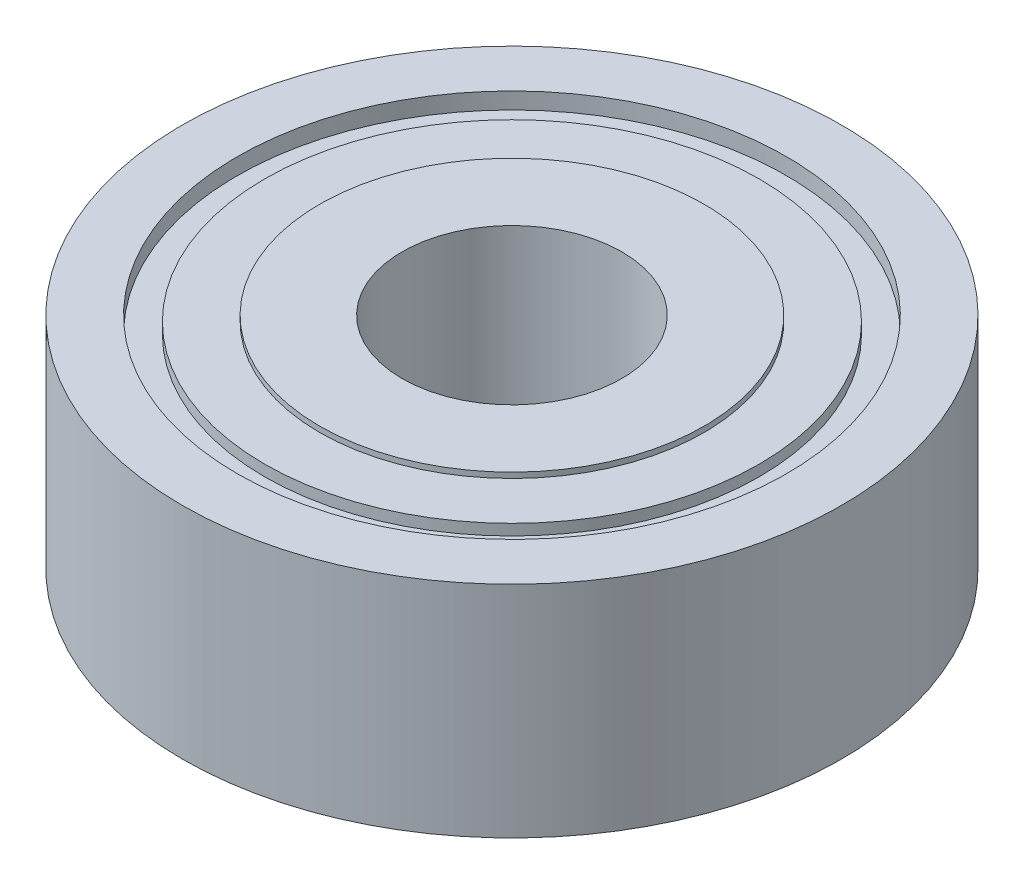
ISO-10303-21;
HEADER;
FILE_DESCRIPTION(('STEP AP214'),'2;1');
FILE_NAME('part.step','',(''),(''),'','','');
FILE_SCHEMA(('AUTOMOTIVE_DESIGN { 1 0 10303 214 1 1 1 1 }'));
ENDSEC;
DATA;
#1=APPLICATION_CONTEXT('core data for automotive mechanical design processes');
#2=APPLICATION_PROTOCOL_DEFINITION('international standard','automotive_design',2000,#1);
#3=PRODUCT_CONTEXT('',#1,'mechanical');
#4=PRODUCT('Part','Part','',(#3));
#5=PRODUCT_RELATED_PRODUCT_CATEGORY('part','',(#4));
#6=PRODUCT_DEFINITION_FORMATION('','',#4);
#7=PRODUCT_DEFINITION_CONTEXT('part definition',#1,'design');
#8=PRODUCT_DEFINITION('design','',#6,#7);
#9=PRODUCT_DEFINITION_SHAPE('','',#8);
#10=(LENGTH_UNIT() NAMED_UNIT(*) SI_UNIT(.MILLI.,.METRE.));
#11=(NAMED_UNIT(*) PLANE_ANGLE_UNIT() SI_UNIT($,.RADIAN.));
#12=(NAMED_UNIT(*) SI_UNIT($,.STERADIAN.) SOLID_ANGLE_UNIT());
#13=UNCERTAINTY_MEASURE_WITH_UNIT(LENGTH_MEASURE(1.E-05),#10,'distance_accuracy_value','');
#14=(GEOMETRIC_REPRESENTATION_CONTEXT(3) GLOBAL_UNCERTAINTY_ASSIGNED_CONTEXT((#13)) GLOBAL_UNIT_ASSIGNED_CONTEXT((#10,
#11,#12)) REPRESENTATION_CONTEXT('',''));
#15=CARTESIAN_POINT('',(0.,0.,0.));
#16=DIRECTION('',(0.,0.,1.));
#17=DIRECTION('',(1.,0.,0.));
#18=AXIS2_PLACEMENT_3D('',#15,#16,#17);
#19=CARTESIAN_POINT('',(0.,3.8,0.));
#20=DIRECTION('',(0.,-1.,0.));
#21=DIRECTION('',(0.,0.,-1.));
#22=AXIS2_PLACEMENT_3D('',#19,#20,#21);
#23=CYLINDRICAL_SURFACE('',#22,9.);
#24=CARTESIAN_POINT('',(0.,-3.8,0.));
#25=DIRECTION('',(0.,1.,0.));
#26=DIRECTION('',(0.,0.,1.));
#27=AXIS2_PLACEMENT_3D('',#24,#25,#26);
#28=CIRCLE('',#27,9.);
#29=CARTESIAN_POINT('',(0.,-3.8,-9.));
#30=VERTEX_POINT('',#29);
#31=EDGE_CURVE('E63',#30,#30,#28,.T.);
#32=CARTESIAN_POINT('',(0.,-3.4,0.));
#33=DIRECTION('',(0.,1.,0.));
#34=DIRECTION('',(0.,0.,1.));
#35=AXIS2_PLACEMENT_3D('',#32,#33,#34);
#36=CIRCLE('',#35,9.);
#37=CARTESIAN_POINT('',(0.,-3.4,-9.));
#38=VERTEX_POINT('',#37);
#39=EDGE_CURVE('E10',#38,#38,#36,.T.);
#40=CARTESIAN_POINT('',(0.,-3.8,-9.));
#41=CARTESIAN_POINT('',(0.,-3.79583333333333,-9.));
#42=CARTESIAN_POINT('',(0.,-3.79166666666667,-9.));
#43=CARTESIAN_POINT('',(0.,-3.78333333333333,-9.));
#44=CARTESIAN_POINT('',(0.,-3.77916666666667,-9.));
#45=CARTESIAN_POINT('',(0.,-3.77083333333333,-9.));
#46=CARTESIAN_POINT('',(0.,-3.76666666666667,-9.));
#47=CARTESIAN_POINT('',(0.,-3.75833333333333,-9.));
#48=CARTESIAN_POINT('',(0.,-3.75416666666667,-9.));
#49=CARTESIAN_POINT('',(0.,-3.74583333333333,-9.));
#50=CARTESIAN_POINT('',(0.,-3.74166666666667,-9.));
#51=CARTESIAN_POINT('',(0.,-3.73333333333333,-9.));
#52=CARTESIAN_POINT('',(0.,-3.72916666666667,-9.));
#53=CARTESIAN_POINT('',(0.,-3.72083333333333,-9.));
#54=CARTESIAN_POINT('',(0.,-3.71666666666667,-9.));
#55=CARTESIAN_POINT('',(0.,-3.70833333333333,-9.));
#56=CARTESIAN_POINT('',(0.,-3.70416666666667,-9.));
#57=CARTESIAN_POINT('',(0.,-3.69583333333333,-9.));
#58=CARTESIAN_POINT('',(0.,-3.69166666666667,-9.));
#59=CARTESIAN_POINT('',(0.,-3.68333333333333,-9.));
#60=CARTESIAN_POINT('',(0.,-3.67916666666667,-9.));
#61=CARTESIAN_POINT('',(0.,-3.67083333333333,-9.));
#62=CARTESIAN_POINT('',(0.,-3.66666666666667,-9.));
#63=CARTESIAN_POINT('',(0.,-3.65833333333333,-9.));
#64=CARTESIAN_POINT('',(0.,-3.65416666666667,-9.));
#65=CARTESIAN_POINT('',(0.,-3.64583333333333,-9.));
#66=CARTESIAN_POINT('',(0.,-3.64166666666667,-9.));
#67=CARTESIAN_POINT('',(0.,-3.63333333333333,-9.));
#68=CARTESIAN_POINT('',(0.,-3.62916666666667,-9.));
#69=CARTESIAN_POINT('',(0.,-3.62083333333333,-9.));
#70=CARTESIAN_POINT('',(0.,-3.61666666666667,-9.));
#71=CARTESIAN_POINT('',(0.,-3.60833333333333,-9.));
#72=CARTESIAN_POINT('',(0.,-3.60416666666667,-9.));
#73=CARTESIAN_POINT('',(0.,-3.59583333333333,-9.));
#74=CARTESIAN_POINT('',(0.,-3.59166666666667,-9.));
#75=CARTESIAN_POINT('',(0.,-3.58333333333333,-9.));
#76=CARTESIAN_POINT('',(0.,-3.57916666666667,-9.));
#77=CARTESIAN_POINT('',(0.,-3.57083333333333,-9.));
#78=CARTESIAN_POINT('',(0.,-3.56666666666667,-9.));
#79=CARTESIAN_POINT('',(0.,-3.55833333333333,-9.));
#80=CARTESIAN_POINT('',(0.,-3.55416666666667,-9.));
#81=CARTESIAN_POINT('',(0.,-3.54583333333333,-9.));
#82=CARTESIAN_POINT('',(0.,-3.54166666666667,-9.));
#83=CARTESIAN_POINT('',(0.,-3.53333333333333,-9.));
#84=CARTESIAN_POINT('',(0.,-3.52916666666667,-9.));
#85=CARTESIAN_POINT('',(0.,-3.52083333333333,-9.));
#86=CARTESIAN_POINT('',(0.,-3.51666666666667,-9.));
#87=CARTESIAN_POINT('',(0.,-3.50833333333333,-9.));
#88=CARTESIAN_POINT('',(0.,-3.50416666666667,-9.));
#89=CARTESIAN_POINT('',(0.,-3.49583333333333,-9.));
#90=CARTESIAN_POINT('',(0.,-3.49166666666667,-9.));
#91=CARTESIAN_POINT('',(0.,-3.48333333333333,-9.));
#92=CARTESIAN_POINT('',(0.,-3.47916666666667,-9.));
#93=CARTESIAN_POINT('',(0.,-3.47083333333333,-9.));
#94=CARTESIAN_POINT('',(0.,-3.46666666666667,-9.));
#95=CARTESIAN_POINT('',(0.,-3.45833333333333,-9.));
#96=CARTESIAN_POINT('',(0.,-3.45416666666667,-9.));
#97=CARTESIAN_POINT('',(0.,-3.44583333333333,-9.));
#98=CARTESIAN_POINT('',(0.,-3.44166666666667,-9.));
#99=CARTESIAN_POINT('',(0.,-3.43333333333333,-9.));
#100=CARTESIAN_POINT('',(0.,-3.42916666666667,-9.));
#101=CARTESIAN_POINT('',(0.,-3.42083333333333,-9.));
#102=CARTESIAN_POINT('',(0.,-3.41666666666667,-9.));
#103=CARTESIAN_POINT('',(0.,-3.40833333333333,-9.));
#104=CARTESIAN_POINT('',(0.,-3.40416666666667,-9.));
#105=CARTESIAN_POINT('',(0.,-3.4,-9.));
#106=B_SPLINE_CURVE_WITH_KNOTS('',3,(#40,#41,#42,#43,#44,#45,#46,#47,#48,#49,#50,#51,#52,#53,
#54,#55,#56,#57,#58,#59,#60,#61,#62,#63,#64,#65,#66,#67,#68,#69,#70,#71,#72,#73,#74,#75,#76,#77,
#78,#79,#80,#81,#82,#83,#84,#85,#86,#87,#88,#89,#90,#91,#92,#93,#94,#95,#96,#97,#98,#99,#100,
#101,#102,#103,#104,#105),.UNSPECIFIED.,.F.,.F.,(4,2,2,2,2,2,2,2,2,2,2,2,2,2,2,2,2,2,2,2,2,2,2,
2,2,2,2,2,2,2,2,2,4),(0.,0.0125000000000004,0.0249999999999998,0.0375000000000002,
0.0499999999999997,0.0625000000000001,0.0749999999999995,0.0874999999999999,0.0999999999999994,
0.1125,0.125,0.1375,0.15,0.162499999999999,0.175,0.187499999999999,0.2,0.2125,0.225,0.2375,
0.249999999999999,0.2625,0.274999999999999,0.2875,0.3,0.312499999999999,0.325,0.337499999999999,
0.35,0.362499999999999,0.374999999999999,0.387499999999999,0.399999999999999),.UNSPECIFIED.);
#107=EDGE_CURVE('BSEAM36',#30,#38,#106,.T.);
#108=ORIENTED_EDGE('',*,*,#31,.T.);
#109=ORIENTED_EDGE('',*,*,#39,.F.);
#110=ORIENTED_EDGE('',*,*,#107,.T.);
#111=ORIENTED_EDGE('',*,*,#107,.F.);
#112=EDGE_LOOP('',(#108,#110,#109,#111));
#113=FACE_BOUND('',#112,.T.);
#114=ADVANCED_FACE('F36',(#113),#23,.T.);
#115=CARTESIAN_POINT('',(0.,4.,0.));
#116=DIRECTION('',(0.,-1.,0.));
#117=DIRECTION('',(0.,0.,-1.));
#118=AXIS2_PLACEMENT_3D('',#115,#116,#117);
#119=CYLINDRICAL_SURFACE('',#118,7.);
#120=CARTESIAN_POINT('',(0.,-4.,0.));
#121=DIRECTION('',(0.,1.,0.));
#122=DIRECTION('',(0.,0.,1.));
#123=AXIS2_PLACEMENT_3D('',#120,#121,#122);
#124=CIRCLE('',#123,7.);
#125=CARTESIAN_POINT('',(0.,-4.,7.));
#126=VERTEX_POINT('',#125);
#127=EDGE_CURVE('E51',#126,#126,#124,.T.);
#128=ORIENTED_EDGE('',*,*,#127,.T.);
#129=EDGE_LOOP('',(#128));
#130=FACE_BOUND('',#129,.T.);
#131=CARTESIAN_POINT('',(0.,-3.8,0.));
#132=DIRECTION('',(0.,1.,0.));
#133=DIRECTION('',(0.,0.,1.));
#134=AXIS2_PLACEMENT_3D('',#131,#132,#133);
#135=CIRCLE('',#134,7.);
#136=CARTESIAN_POINT('',(0.,-3.8,7.));
#137=VERTEX_POINT('',#136);
#138=EDGE_CURVE('E43',#137,#137,#135,.T.);
#139=ORIENTED_EDGE('',*,*,#138,.F.);
#140=EDGE_LOOP('',(#139));
#141=FACE_BOUND('',#140,.T.);
#142=ADVANCED_FACE('F112',(#130,#141),#119,.T.);
#143=CARTESIAN_POINT('',(0.,4.,0.));
#144=DIRECTION('',(0.,1.,0.));
#145=DIRECTION('',(0.,0.,1.));
#146=AXIS2_PLACEMENT_3D('',#143,#144,#145);
#147=PLANE('',#146);
#148=CARTESIAN_POINT('',(0.,4.,0.));
#149=DIRECTION('',(0.,1.,0.));
#150=DIRECTION('',(0.,0.,1.));
#151=AXIS2_PLACEMENT_3D('',#148,#149,#150);
#152=CIRCLE('',#151,7.);
#153=CARTESIAN_POINT('',(0.,4.,7.));
#154=VERTEX_POINT('',#153);
#155=EDGE_CURVE('E47',#154,#154,#152,.T.);
#156=ORIENTED_EDGE('',*,*,#155,.T.);
#157=EDGE_LOOP('',(#156));
#158=FACE_BOUND('',#157,.T.);
#159=CARTESIAN_POINT('',(0.,4.,0.));
#160=DIRECTION('',(0.,1.,0.));
#161=DIRECTION('',(0.,0.,1.));
#162=AXIS2_PLACEMENT_3D('',#159,#160,#161);
#163=CIRCLE('',#162,4.);
#164=CARTESIAN_POINT('',(0.,4.,4.));
#165=VERTEX_POINT('',#164);
#166=EDGE_CURVE('E55',#165,#165,#163,.T.);
#167=ORIENTED_EDGE('',*,*,#166,.F.);
#168=EDGE_LOOP('',(#167));
#169=FACE_BOUND('',#168,.T.);
#170=ADVANCED_FACE('F119',(#158,#169),#147,.T.);
#171=CARTESIAN_POINT('',(0.,-4.,0.));
#172=DIRECTION('',(0.,1.,0.));
#173=DIRECTION('',(0.,0.,1.));
#174=AXIS2_PLACEMENT_3D('',#171,#172,#173);
#175=PLANE('',#174);
#176=ORIENTED_EDGE('',*,*,#127,.F.);
#177=EDGE_LOOP('',(#176));
#178=FACE_BOUND('',#177,.T.);
#179=CARTESIAN_POINT('',(0.,-4.,0.));
#180=DIRECTION('',(0.,1.,0.));
#181=DIRECTION('',(0.,0.,1.));
#182=AXIS2_PLACEMENT_3D('',#179,#180,#181);
#183=CIRCLE('',#182,4.);
#184=CARTESIAN_POINT('',(0.,-4.,4.));
#185=VERTEX_POINT('',#184);
#186=EDGE_CURVE('E57',#185,#185,#183,.T.);
#187=ORIENTED_EDGE('',*,*,#186,.T.);
#188=EDGE_LOOP('',(#187));
#189=FACE_BOUND('',#188,.T.);
#190=ADVANCED_FACE('F148',(#178,#189),#175,.F.);
#191=CARTESIAN_POINT('',(0.,3.8,0.));
#192=DIRECTION('',(0.,1.,0.));
#193=DIRECTION('',(0.,0.,1.));
#194=AXIS2_PLACEMENT_3D('',#191,#192,#193);
#195=CIRCLE('',#194,7.);
#196=CARTESIAN_POINT('',(0.,3.8,7.));
#197=VERTEX_POINT('',#196);
#198=EDGE_CURVE('E66',#197,#197,#195,.T.);
#199=ORIENTED_EDGE('',*,*,#198,.T.);
#200=EDGE_LOOP('',(#199));
#201=FACE_BOUND('',#200,.T.);
#202=ORIENTED_EDGE('',*,*,#155,.F.);
#203=EDGE_LOOP('',(#202));
#204=FACE_BOUND('',#203,.T.);
#205=ADVANCED_FACE('F38',(#201,#204),#119,.T.);
#206=CARTESIAN_POINT('',(0.,4.,0.));
#207=DIRECTION('',(0.,-1.,0.));
#208=DIRECTION('',(0.,0.,-1.));
#209=AXIS2_PLACEMENT_3D('',#206,#207,#208);
#210=CYLINDRICAL_SURFACE('',#209,4.);
#211=ORIENTED_EDGE('',*,*,#166,.T.);
#212=EDGE_LOOP('',(#211));
#213=FACE_BOUND('',#212,.T.);
#214=ORIENTED_EDGE('',*,*,#186,.F.);
#215=EDGE_LOOP('',(#214));
#216=FACE_BOUND('',#215,.T.);
#217=ADVANCED_FACE('F142',(#213,#216),#210,.F.);
#218=CARTESIAN_POINT('',(0.,3.8,0.));
#219=DIRECTION('',(0.,1.,0.));
#220=DIRECTION('',(0.,0.,1.));
#221=AXIS2_PLACEMENT_3D('',#218,#219,#220);
#222=PLANE('',#221);
#223=CARTESIAN_POINT('',(0.,3.8,0.));
#224=DIRECTION('',(0.,1.,0.));
#225=DIRECTION('',(0.,0.,1.));
#226=AXIS2_PLACEMENT_3D('',#223,#224,#225);
#227=CIRCLE('',#226,9.);
#228=CARTESIAN_POINT('',(0.,3.8,-9.));
#229=VERTEX_POINT('',#228);
#230=EDGE_CURVE('E60',#229,#229,#227,.T.);
#231=ORIENTED_EDGE('',*,*,#230,.T.);
#232=EDGE_LOOP('',(#231));
#233=FACE_BOUND('',#232,.T.);
#234=ORIENTED_EDGE('',*,*,#198,.F.);
#235=EDGE_LOOP('',(#234));
#236=FACE_BOUND('',#235,.T.);
#237=ADVANCED_FACE('F134',(#233,#236),#222,.T.);
#238=CARTESIAN_POINT('',(0.,-3.8,0.));
#239=DIRECTION('',(0.,1.,0.));
#240=DIRECTION('',(0.,0.,1.));
#241=AXIS2_PLACEMENT_3D('',#238,#239,#240);
#242=PLANE('',#241);
#243=ORIENTED_EDGE('',*,*,#31,.F.);
#244=EDGE_LOOP('',(#243));
#245=FACE_BOUND('',#244,.T.);
#246=ORIENTED_EDGE('',*,*,#138,.T.);
#247=EDGE_LOOP('',(#246));
#248=FACE_BOUND('',#247,.T.);
#249=ADVANCED_FACE('F126',(#245,#248),#242,.F.);
#250=CARTESIAN_POINT('',(0.,3.4,0.));
#251=DIRECTION('',(0.,1.,0.));
#252=DIRECTION('',(0.,0.,1.));
#253=AXIS2_PLACEMENT_3D('',#250,#251,#252);
#254=CIRCLE('',#253,9.);
#255=CARTESIAN_POINT('',(0.,3.4,-9.));
#256=VERTEX_POINT('',#255);
#257=EDGE_CURVE('E71',#256,#256,#254,.T.);
#258=CARTESIAN_POINT('',(0.,3.4,-9.));
#259=CARTESIAN_POINT('',(0.,3.40416666666667,-9.));
#260=CARTESIAN_POINT('',(0.,3.40833333333333,-9.));
#261=CARTESIAN_POINT('',(0.,3.41666666666667,-9.));
#262=CARTESIAN_POINT('',(0.,3.42083333333333,-9.));
#263=CARTESIAN_POINT('',(0.,3.42916666666667,-9.));
#264=CARTESIAN_POINT('',(0.,3.43333333333333,-9.));
#265=CARTESIAN_POINT('',(0.,3.44166666666667,-9.));
#266=CARTESIAN_POINT('',(0.,3.44583333333333,-9.));
#267=CARTESIAN_POINT('',(0.,3.45416666666667,-9.));
#268=CARTESIAN_POINT('',(0.,3.45833333333333,-9.));
#269=CARTESIAN_POINT('',(0.,3.46666666666667,-9.));
#270=CARTESIAN_POINT('',(0.,3.47083333333333,-9.));
#271=CARTESIAN_POINT('',(0.,3.47916666666667,-9.));
#272=CARTESIAN_POINT('',(0.,3.48333333333333,-9.));
#273=CARTESIAN_POINT('',(0.,3.49166666666667,-9.));
#274=CARTESIAN_POINT('',(0.,3.49583333333333,-9.));
#275=CARTESIAN_POINT('',(0.,3.50416666666667,-9.));
#276=CARTESIAN_POINT('',(0.,3.50833333333333,-9.));
#277=CARTESIAN_POINT('',(0.,3.51666666666667,-9.));
#278=CARTESIAN_POINT('',(0.,3.52083333333333,-9.));
#279=CARTESIAN_POINT('',(0.,3.52916666666667,-9.));
#280=CARTESIAN_POINT('',(0.,3.53333333333333,-9.));
#281=CARTESIAN_POINT('',(0.,3.54166666666667,-9.));
#282=CARTESIAN_POINT('',(0.,3.54583333333333,-9.));
#283=CARTESIAN_POINT('',(0.,3.55416666666667,-9.));
#284=CARTESIAN_POINT('',(0.,3.55833333333333,-9.));
#285=CARTESIAN_POINT('',(0.,3.56666666666667,-9.));
#286=CARTESIAN_POINT('',(0.,3.57083333333333,-9.));
#287=CARTESIAN_POINT('',(0.,3.57916666666667,-9.));
#288=CARTESIAN_POINT('',(0.,3.58333333333333,-9.));
#289=CARTESIAN_POINT('',(0.,3.59166666666667,-9.));
#290=CARTESIAN_POINT('',(0.,3.59583333333333,-9.));
#291=CARTESIAN_POINT('',(0.,3.60416666666667,-9.));
#292=CARTESIAN_POINT('',(0.,3.60833333333333,-9.));
#293=CARTESIAN_POINT('',(0.,3.61666666666667,-9.));
#294=CARTESIAN_POINT('',(0.,3.62083333333333,-9.));
#295=CARTESIAN_POINT('',(0.,3.62916666666667,-9.));
#296=CARTESIAN_POINT('',(0.,3.63333333333333,-9.));
#297=CARTESIAN_POINT('',(0.,3.64166666666667,-9.));
#298=CARTESIAN_POINT('',(0.,3.64583333333333,-9.));
#299=CARTESIAN_POINT('',(0.,3.65416666666667,-9.));
#300=CARTESIAN_POINT('',(0.,3.65833333333333,-9.));
#301=CARTESIAN_POINT('',(0.,3.66666666666667,-9.));
#302=CARTESIAN_POINT('',(0.,3.67083333333333,-9.));
#303=CARTESIAN_POINT('',(0.,3.67916666666667,-9.));
#304=CARTESIAN_POINT('',(0.,3.68333333333333,-9.));
#305=CARTESIAN_POINT('',(0.,3.69166666666667,-9.));
#306=CARTESIAN_POINT('',(0.,3.69583333333333,-9.));
#307=CARTESIAN_POINT('',(0.,3.70416666666667,-9.));
#308=CARTESIAN_POINT('',(0.,3.70833333333333,-9.));
#309=CARTESIAN_POINT('',(0.,3.71666666666667,-9.));
#310=CARTESIAN_POINT('',(0.,3.72083333333333,-9.));
#311=CARTESIAN_POINT('',(0.,3.72916666666667,-9.));
#312=CARTESIAN_POINT('',(0.,3.73333333333333,-9.));
#313=CARTESIAN_POINT('',(0.,3.74166666666667,-9.));
#314=CARTESIAN_POINT('',(0.,3.74583333333333,-9.));
#315=CARTESIAN_POINT('',(0.,3.75416666666667,-9.));
#316=CARTESIAN_POINT('',(0.,3.75833333333333,-9.));
#317=CARTESIAN_POINT('',(0.,3.76666666666667,-9.));
#318=CARTESIAN_POINT('',(0.,3.77083333333333,-9.));
#319=CARTESIAN_POINT('',(0.,3.77916666666667,-9.));
#320=CARTESIAN_POINT('',(0.,3.78333333333333,-9.));
#321=CARTESIAN_POINT('',(0.,3.79166666666667,-9.));
#322=CARTESIAN_POINT('',(0.,3.79583333333333,-9.));
#323=CARTESIAN_POINT('',(0.,3.8,-9.));
#324=B_SPLINE_CURVE_WITH_KNOTS('',3,(#258,#259,#260,#261,#262,#263,#264,#265,#266,#267,#268,
#269,#270,#271,#272,#273,#274,#275,#276,#277,#278,#279,#280,#281,#282,#283,#284,#285,#286,#287,
#288,#289,#290,#291,#292,#293,#294,#295,#296,#297,#298,#299,#300,#301,#302,#303,#304,#305,#306,
#307,#308,#309,#310,#311,#312,#313,#314,#315,#316,#317,#318,#319,#320,#321,#322,#323),
.UNSPECIFIED.,.F.,.F.,(4,2,2,2,2,2,2,2,2,2,2,2,2,2,2,2,2,2,2,2,2,2,2,2,2,2,2,2,2,2,2,2,4),(0.,
0.0124999999999999,0.0249999999999998,0.0374999999999998,0.0499999999999997,0.0625000000000001,
0.075,0.0874999999999999,0.0999999999999998,0.1125,0.125,0.1375,0.15,0.1625,0.175,0.1875,0.2,
0.2125,0.225,0.2375,0.25,0.2625,0.275,0.2875,0.3,0.3125,0.325,0.3375,0.35,0.3625,0.375,0.3875,
0.4),.UNSPECIFIED.);
#325=EDGE_CURVE('BSEAM115',#256,#229,#324,.T.);
#326=ORIENTED_EDGE('',*,*,#257,.T.);
#327=ORIENTED_EDGE('',*,*,#230,.F.);
#328=ORIENTED_EDGE('',*,*,#325,.T.);
#329=ORIENTED_EDGE('',*,*,#325,.F.);
#330=EDGE_LOOP('',(#326,#328,#327,#329));
#331=FACE_BOUND('',#330,.T.);
#332=ADVANCED_FACE('F115',(#331),#23,.T.);
#333=CARTESIAN_POINT('',(0.,3.4,0.));
#334=DIRECTION('',(0.,1.,0.));
#335=DIRECTION('',(0.,0.,1.));
#336=AXIS2_PLACEMENT_3D('',#333,#334,#335);
#337=PLANE('',#336);
#338=ORIENTED_EDGE('',*,*,#257,.F.);
#339=EDGE_LOOP('',(#338));
#340=FACE_BOUND('',#339,.T.);
#341=CARTESIAN_POINT('',(0.,3.4,0.));
#342=DIRECTION('',(0.,1.,0.));
#343=DIRECTION('',(0.,0.,1.));
#344=AXIS2_PLACEMENT_3D('',#341,#342,#343);
#345=CIRCLE('',#344,10.);
#346=CARTESIAN_POINT('',(0.,3.4,10.));
#347=VERTEX_POINT('',#346);
#348=EDGE_CURVE('E75',#347,#347,#345,.F.);
#349=ORIENTED_EDGE('',*,*,#348,.F.);
#350=EDGE_LOOP('',(#349));
#351=FACE_BOUND('',#350,.T.);
#352=ADVANCED_FACE('F125',(#340,#351),#337,.T.);
#353=CARTESIAN_POINT('',(0.,-3.4,0.));
#354=DIRECTION('',(0.,1.,0.));
#355=DIRECTION('',(0.,0.,1.));
#356=AXIS2_PLACEMENT_3D('',#353,#354,#355);
#357=PLANE('',#356);
#358=ORIENTED_EDGE('',*,*,#39,.T.);
#359=EDGE_LOOP('',(#358));
#360=FACE_BOUND('',#359,.T.);
#361=CARTESIAN_POINT('',(0.,-3.4,0.));
#362=DIRECTION('',(0.,1.,0.));
#363=DIRECTION('',(0.,0.,1.));
#364=AXIS2_PLACEMENT_3D('',#361,#362,#363);
#365=CIRCLE('',#364,10.);
#366=CARTESIAN_POINT('',(0.,-3.4,10.));
#367=VERTEX_POINT('',#366);
#368=EDGE_CURVE('E72',#367,#367,#365,.T.);
#369=ORIENTED_EDGE('',*,*,#368,.F.);
#370=EDGE_LOOP('',(#369));
#371=FACE_BOUND('',#370,.T.);
#372=ADVANCED_FACE('F108',(#360,#371),#357,.F.);
#373=CARTESIAN_POINT('',(0.,4.,0.));
#374=DIRECTION('',(0.,-1.,0.));
#375=DIRECTION('',(0.,0.,-1.));
#376=AXIS2_PLACEMENT_3D('',#373,#374,#375);
#377=CYLINDRICAL_SURFACE('',#376,10.);
#378=CARTESIAN_POINT('',(0.,-4.,0.));
#379=DIRECTION('',(0.,1.,0.));
#380=DIRECTION('',(0.,0.,1.));
#381=AXIS2_PLACEMENT_3D('',#378,#379,#380);
#382=CIRCLE('',#381,10.);
#383=CARTESIAN_POINT('',(0.,-4.,10.));
#384=VERTEX_POINT('',#383);
#385=EDGE_CURVE('E87',#384,#384,#382,.T.);
#386=ORIENTED_EDGE('',*,*,#385,.F.);
#387=EDGE_LOOP('',(#386));
#388=FACE_BOUND('',#387,.T.);
#389=ORIENTED_EDGE('',*,*,#368,.T.);
#390=EDGE_LOOP('',(#389));
#391=FACE_BOUND('',#390,.T.);
#392=ADVANCED_FACE('F98',(#388,#391),#377,.F.);
#393=CARTESIAN_POINT('',(0.,4.,0.));
#394=DIRECTION('',(0.,1.,0.));
#395=DIRECTION('',(0.,0.,1.));
#396=AXIS2_PLACEMENT_3D('',#393,#394,#395);
#397=PLANE('',#396);
#398=CARTESIAN_POINT('',(0.,4.,0.));
#399=DIRECTION('',(0.,1.,0.));
#400=DIRECTION('',(0.,0.,1.));
#401=AXIS2_PLACEMENT_3D('',#398,#399,#400);
#402=CIRCLE('',#401,12.);
#403=CARTESIAN_POINT('',(0.,4.,12.));
#404=VERTEX_POINT('',#403);
#405=EDGE_CURVE('E80',#404,#404,#402,.T.);
#406=ORIENTED_EDGE('',*,*,#405,.T.);
#407=EDGE_LOOP('',(#406));
#408=FACE_BOUND('',#407,.T.);
#409=CARTESIAN_POINT('',(0.,4.,0.));
#410=DIRECTION('',(0.,1.,0.));
#411=DIRECTION('',(0.,0.,1.));
#412=AXIS2_PLACEMENT_3D('',#409,#410,#411);
#413=CIRCLE('',#412,10.);
#414=CARTESIAN_POINT('',(0.,4.,10.));
#415=VERTEX_POINT('',#414);
#416=EDGE_CURVE('E84',#415,#415,#413,.T.);
#417=ORIENTED_EDGE('',*,*,#416,.F.);
#418=EDGE_LOOP('',(#417));
#419=FACE_BOUND('',#418,.T.);
#420=ADVANCED_FACE('F95',(#408,#419),#397,.T.);
#421=CARTESIAN_POINT('',(0.,-4.,0.));
#422=DIRECTION('',(0.,1.,0.));
#423=DIRECTION('',(0.,0.,1.));
#424=AXIS2_PLACEMENT_3D('',#421,#422,#423);
#425=PLANE('',#424);
#426=CARTESIAN_POINT('',(0.,-4.,0.));
#427=DIRECTION('',(0.,1.,0.));
#428=DIRECTION('',(0.,0.,1.));
#429=AXIS2_PLACEMENT_3D('',#426,#427,#428);
#430=CIRCLE('',#429,12.);
#431=CARTESIAN_POINT('',(0.,-4.,12.));
#432=VERTEX_POINT('',#431);
#433=EDGE_CURVE('E81',#432,#432,#430,.T.);
#434=ORIENTED_EDGE('',*,*,#433,.F.);
#435=EDGE_LOOP('',(#434));
#436=FACE_BOUND('',#435,.T.);
#437=ORIENTED_EDGE('',*,*,#385,.T.);
#438=EDGE_LOOP('',(#437));
#439=FACE_BOUND('',#438,.T.);
#440=ADVANCED_FACE('F97',(#436,#439),#425,.F.);
#441=CARTESIAN_POINT('',(0.,4.,0.));
#442=DIRECTION('',(0.,-1.,0.));
#443=DIRECTION('',(0.,0.,-1.));
#444=AXIS2_PLACEMENT_3D('',#441,#442,#443);
#445=CYLINDRICAL_SURFACE('',#444,12.);
#446=ORIENTED_EDGE('',*,*,#405,.F.);
#447=EDGE_LOOP('',(#446));
#448=FACE_BOUND('',#447,.T.);
#449=ORIENTED_EDGE('',*,*,#433,.T.);
#450=EDGE_LOOP('',(#449));
#451=FACE_BOUND('',#450,.T.);
#452=ADVANCED_FACE('F105',(#448,#451),#445,.T.);
#453=ORIENTED_EDGE('',*,*,#348,.T.);
#454=EDGE_LOOP('',(#453));
#455=FACE_BOUND('',#454,.T.);
#456=ORIENTED_EDGE('',*,*,#416,.T.);
#457=EDGE_LOOP('',(#456));
#458=FACE_BOUND('',#457,.T.);
#459=ADVANCED_FACE('F93',(#455,#458),#377,.F.);
#460=CLOSED_SHELL('',(#114,#142,#170,#190,#205,#217,#237,#249,#332,#352,#372,#392,#420,#440,
#452,#459));
#461=MANIFOLD_SOLID_BREP('B2',#460);
#462=ADVANCED_BREP_SHAPE_REPRESENTATION('',(#18,#461),#14);
#463=SHAPE_DEFINITION_REPRESENTATION(#9,#462);
ENDSEC;
END-ISO-10303-21;
